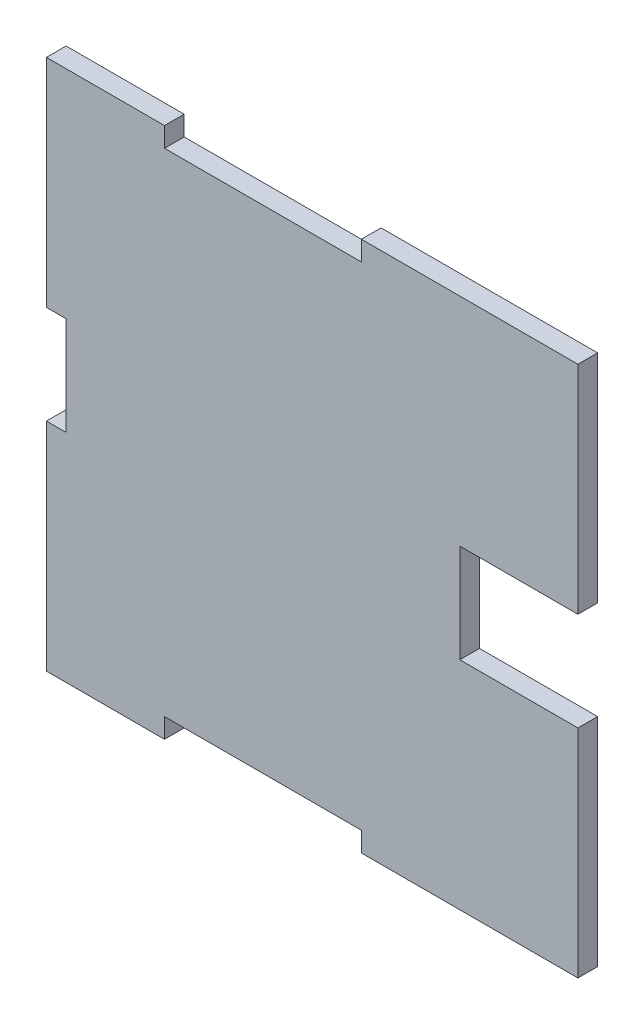
ISO-10303-21;
HEADER;
FILE_DESCRIPTION(('STEP AP214'),'2;1');
FILE_NAME('part.step','',(''),(''),'','','');
FILE_SCHEMA(('AUTOMOTIVE_DESIGN { 1 0 10303 214 1 1 1 1 }'));
ENDSEC;
DATA;
#1=APPLICATION_CONTEXT('core data for automotive mechanical design processes');
#2=APPLICATION_PROTOCOL_DEFINITION('international standard','automotive_design',2000,#1);
#3=PRODUCT_CONTEXT('',#1,'mechanical');
#4=PRODUCT('Part','Part','',(#3));
#5=PRODUCT_RELATED_PRODUCT_CATEGORY('part','',(#4));
#6=PRODUCT_DEFINITION_FORMATION('','',#4);
#7=PRODUCT_DEFINITION_CONTEXT('part definition',#1,'design');
#8=PRODUCT_DEFINITION('design','',#6,#7);
#9=PRODUCT_DEFINITION_SHAPE('','',#8);
#10=(LENGTH_UNIT() NAMED_UNIT(*) SI_UNIT(.MILLI.,.METRE.));
#11=(NAMED_UNIT(*) PLANE_ANGLE_UNIT() SI_UNIT($,.RADIAN.));
#12=(NAMED_UNIT(*) SI_UNIT($,.STERADIAN.) SOLID_ANGLE_UNIT());
#13=UNCERTAINTY_MEASURE_WITH_UNIT(LENGTH_MEASURE(1.E-05),#10,'distance_accuracy_value','');
#14=(GEOMETRIC_REPRESENTATION_CONTEXT(3) GLOBAL_UNCERTAINTY_ASSIGNED_CONTEXT((#13)) GLOBAL_UNIT_ASSIGNED_CONTEXT((#10,
#11,#12)) REPRESENTATION_CONTEXT('',''));
#15=CARTESIAN_POINT('',(0.,0.,0.));
#16=DIRECTION('',(0.,0.,1.));
#17=DIRECTION('',(1.,0.,0.));
#18=AXIS2_PLACEMENT_3D('',#15,#16,#17);
#19=CARTESIAN_POINT('',(54.,-54.,4.));
#20=DIRECTION('',(-1.,0.,0.));
#21=DIRECTION('',(0.,0.,1.));
#22=AXIS2_PLACEMENT_3D('',#19,#20,#21);
#23=PLANE('',#22);
#24=DIRECTION('',(0.,1.,0.));
#25=VECTOR('',#24,1.);
#26=CARTESIAN_POINT('',(54.,-54.,0.));
#27=LINE('',#26,#25);
#28=CARTESIAN_POINT('',(54.,-54.,0.));
#29=VERTEX_POINT('',#28);
#30=CARTESIAN_POINT('',(54.,-10.,0.));
#31=VERTEX_POINT('',#30);
#32=EDGE_CURVE('E342',#29,#31,#27,.T.);
#33=ORIENTED_EDGE('',*,*,#32,.T.);
#34=DIRECTION('',(0.,0.,1.));
#35=VECTOR('',#34,1.);
#36=CARTESIAN_POINT('',(54.,-10.,4.));
#37=LINE('',#36,#35);
#38=CARTESIAN_POINT('',(54.,-10.,4.));
#39=VERTEX_POINT('',#38);
#40=EDGE_CURVE('E309',#31,#39,#37,.T.);
#41=ORIENTED_EDGE('',*,*,#40,.T.);
#42=DIRECTION('',(0.,1.,0.));
#43=VECTOR('',#42,1.);
#44=CARTESIAN_POINT('',(54.,-54.,4.));
#45=LINE('',#44,#43);
#46=CARTESIAN_POINT('',(54.,-54.,4.));
#47=VERTEX_POINT('',#46);
#48=EDGE_CURVE('E322',#47,#39,#45,.T.);
#49=ORIENTED_EDGE('',*,*,#48,.F.);
#50=DIRECTION('',(0.,0.,-1.));
#51=VECTOR('',#50,1.);
#52=CARTESIAN_POINT('',(54.,-54.,4.));
#53=LINE('',#52,#51);
#54=EDGE_CURVE('E341',#47,#29,#53,.T.);
#55=ORIENTED_EDGE('',*,*,#54,.T.);
#56=EDGE_LOOP('',(#33,#41,#49,#55));
#57=FACE_BOUND('',#56,.T.);
#58=ADVANCED_FACE('F39',(#57),#23,.F.);
#59=CARTESIAN_POINT('',(-54.,54.,4.));
#60=DIRECTION('',(0.,-1.,0.));
#61=DIRECTION('',(0.,0.,-1.));
#62=AXIS2_PLACEMENT_3D('',#59,#60,#61);
#63=PLANE('',#62);
#64=DIRECTION('',(-1.,0.,0.));
#65=VECTOR('',#64,1.);
#66=CARTESIAN_POINT('',(-54.,54.,4.));
#67=LINE('',#66,#65);
#68=CARTESIAN_POINT('',(-30.,54.,4.));
#69=VERTEX_POINT('',#68);
#70=CARTESIAN_POINT('',(-54.,54.,4.));
#71=VERTEX_POINT('',#70);
#72=EDGE_CURVE('E326',#69,#71,#67,.T.);
#73=ORIENTED_EDGE('',*,*,#72,.F.);
#74=DIRECTION('',(0.,0.,-1.));
#75=VECTOR('',#74,1.);
#76=CARTESIAN_POINT('',(-30.,54.,4.));
#77=LINE('',#76,#75);
#78=CARTESIAN_POINT('',(-30.,54.,0.));
#79=VERTEX_POINT('',#78);
#80=EDGE_CURVE('E198',#69,#79,#77,.T.);
#81=ORIENTED_EDGE('',*,*,#80,.T.);
#82=DIRECTION('',(-1.,0.,0.));
#83=VECTOR('',#82,1.);
#84=CARTESIAN_POINT('',(-54.,54.,0.));
#85=LINE('',#84,#83);
#86=CARTESIAN_POINT('',(-54.,54.,0.));
#87=VERTEX_POINT('',#86);
#88=EDGE_CURVE('E346',#79,#87,#85,.T.);
#89=ORIENTED_EDGE('',*,*,#88,.T.);
#90=DIRECTION('',(0.,0.,-1.));
#91=VECTOR('',#90,1.);
#92=CARTESIAN_POINT('',(-54.,54.,4.));
#93=LINE('',#92,#91);
#94=EDGE_CURVE('E368',#71,#87,#93,.T.);
#95=ORIENTED_EDGE('',*,*,#94,.F.);
#96=EDGE_LOOP('',(#73,#81,#89,#95));
#97=FACE_BOUND('',#96,.T.);
#98=ADVANCED_FACE('F456',(#97),#63,.F.);
#99=CARTESIAN_POINT('',(-54.,-54.,4.));
#100=DIRECTION('',(1.,0.,0.));
#101=DIRECTION('',(0.,0.,-1.));
#102=AXIS2_PLACEMENT_3D('',#99,#100,#101);
#103=PLANE('',#102);
#104=DIRECTION('',(0.,-1.,0.));
#105=VECTOR('',#104,1.);
#106=CARTESIAN_POINT('',(-54.,-54.,4.));
#107=LINE('',#106,#105);
#108=CARTESIAN_POINT('',(-54.,-10.,4.));
#109=VERTEX_POINT('',#108);
#110=CARTESIAN_POINT('',(-54.,-54.,4.));
#111=VERTEX_POINT('',#110);
#112=EDGE_CURVE('E331',#109,#111,#107,.T.);
#113=ORIENTED_EDGE('',*,*,#112,.F.);
#114=DIRECTION('',(0.,0.,-1.));
#115=VECTOR('',#114,1.);
#116=CARTESIAN_POINT('',(-54.,-10.,4.));
#117=LINE('',#116,#115);
#118=CARTESIAN_POINT('',(-54.,-10.,0.));
#119=VERTEX_POINT('',#118);
#120=EDGE_CURVE('E315',#109,#119,#117,.T.);
#121=ORIENTED_EDGE('',*,*,#120,.T.);
#122=DIRECTION('',(0.,-1.,0.));
#123=VECTOR('',#122,1.);
#124=CARTESIAN_POINT('',(-54.,-54.,0.));
#125=LINE('',#124,#123);
#126=CARTESIAN_POINT('',(-54.,-54.,0.));
#127=VERTEX_POINT('',#126);
#128=EDGE_CURVE('E351',#119,#127,#125,.T.);
#129=ORIENTED_EDGE('',*,*,#128,.T.);
#130=DIRECTION('',(0.,0.,-1.));
#131=VECTOR('',#130,1.);
#132=CARTESIAN_POINT('',(-54.,-54.,4.));
#133=LINE('',#132,#131);
#134=EDGE_CURVE('E364',#111,#127,#133,.T.);
#135=ORIENTED_EDGE('',*,*,#134,.F.);
#136=EDGE_LOOP('',(#113,#121,#129,#135));
#137=FACE_BOUND('',#136,.T.);
#138=ADVANCED_FACE('F395',(#137),#103,.F.);
#139=CARTESIAN_POINT('',(-54.,-54.,4.));
#140=DIRECTION('',(0.,1.,0.));
#141=DIRECTION('',(0.,0.,1.));
#142=AXIS2_PLACEMENT_3D('',#139,#140,#141);
#143=PLANE('',#142);
#144=DIRECTION('',(1.,0.,0.));
#145=VECTOR('',#144,1.);
#146=CARTESIAN_POINT('',(-54.,-54.,0.));
#147=LINE('',#146,#145);
#148=CARTESIAN_POINT('',(-30.,-54.,0.));
#149=VERTEX_POINT('',#148);
#150=EDGE_CURVE('E357',#127,#149,#147,.T.);
#151=ORIENTED_EDGE('',*,*,#150,.T.);
#152=DIRECTION('',(0.,0.,-1.));
#153=VECTOR('',#152,1.);
#154=CARTESIAN_POINT('',(-30.,-54.,4.));
#155=LINE('',#154,#153);
#156=CARTESIAN_POINT('',(-30.,-54.,4.));
#157=VERTEX_POINT('',#156);
#158=EDGE_CURVE('E216',#157,#149,#155,.T.);
#159=ORIENTED_EDGE('',*,*,#158,.F.);
#160=DIRECTION('',(1.,0.,0.));
#161=VECTOR('',#160,1.);
#162=CARTESIAN_POINT('',(-54.,-54.,4.));
#163=LINE('',#162,#161);
#164=EDGE_CURVE('E337',#111,#157,#163,.T.);
#165=ORIENTED_EDGE('',*,*,#164,.F.);
#166=ORIENTED_EDGE('',*,*,#134,.T.);
#167=EDGE_LOOP('',(#151,#159,#165,#166));
#168=FACE_BOUND('',#167,.T.);
#169=ADVANCED_FACE('F444',(#168),#143,.F.);
#170=CARTESIAN_POINT('',(54.,10.,4.));
#171=VERTEX_POINT('',#170);
#172=CARTESIAN_POINT('',(54.,54.,4.));
#173=VERTEX_POINT('',#172);
#174=EDGE_CURVE('E327',#171,#173,#45,.T.);
#175=ORIENTED_EDGE('',*,*,#174,.F.);
#176=DIRECTION('',(0.,0.,-1.));
#177=VECTOR('',#176,1.);
#178=CARTESIAN_POINT('',(54.,10.,4.));
#179=LINE('',#178,#177);
#180=CARTESIAN_POINT('',(54.,10.,0.));
#181=VERTEX_POINT('',#180);
#182=EDGE_CURVE('E305',#171,#181,#179,.T.);
#183=ORIENTED_EDGE('',*,*,#182,.T.);
#184=CARTESIAN_POINT('',(54.,54.,0.));
#185=VERTEX_POINT('',#184);
#186=EDGE_CURVE('E321',#181,#185,#27,.T.);
#187=ORIENTED_EDGE('',*,*,#186,.T.);
#188=DIRECTION('',(0.,0.,-1.));
#189=VECTOR('',#188,1.);
#190=CARTESIAN_POINT('',(54.,54.,4.));
#191=LINE('',#190,#189);
#192=EDGE_CURVE('E372',#173,#185,#191,.T.);
#193=ORIENTED_EDGE('',*,*,#192,.F.);
#194=EDGE_LOOP('',(#175,#183,#187,#193));
#195=FACE_BOUND('',#194,.T.);
#196=ADVANCED_FACE('F41',(#195),#23,.F.);
#197=CARTESIAN_POINT('',(10.,54.,0.));
#198=VERTEX_POINT('',#197);
#199=EDGE_CURVE('E347',#185,#198,#85,.T.);
#200=ORIENTED_EDGE('',*,*,#199,.T.);
#201=DIRECTION('',(0.,0.,1.));
#202=VECTOR('',#201,1.);
#203=CARTESIAN_POINT('',(10.,54.,4.));
#204=LINE('',#203,#202);
#205=CARTESIAN_POINT('',(10.,54.,4.));
#206=VERTEX_POINT('',#205);
#207=EDGE_CURVE('E54',#198,#206,#204,.T.);
#208=ORIENTED_EDGE('',*,*,#207,.T.);
#209=EDGE_CURVE('E328',#173,#206,#67,.T.);
#210=ORIENTED_EDGE('',*,*,#209,.F.);
#211=ORIENTED_EDGE('',*,*,#192,.T.);
#212=EDGE_LOOP('',(#200,#208,#210,#211));
#213=FACE_BOUND('',#212,.T.);
#214=ADVANCED_FACE('F413',(#213),#63,.F.);
#215=CARTESIAN_POINT('',(-54.,10.,0.));
#216=VERTEX_POINT('',#215);
#217=EDGE_CURVE('E352',#87,#216,#125,.T.);
#218=ORIENTED_EDGE('',*,*,#217,.T.);
#219=DIRECTION('',(0.,0.,1.));
#220=VECTOR('',#219,1.);
#221=CARTESIAN_POINT('',(-54.,10.,4.));
#222=LINE('',#221,#220);
#223=CARTESIAN_POINT('',(-54.,10.,4.));
#224=VERTEX_POINT('',#223);
#225=EDGE_CURVE('E62',#216,#224,#222,.T.);
#226=ORIENTED_EDGE('',*,*,#225,.T.);
#227=EDGE_CURVE('E332',#71,#224,#107,.T.);
#228=ORIENTED_EDGE('',*,*,#227,.F.);
#229=ORIENTED_EDGE('',*,*,#94,.T.);
#230=EDGE_LOOP('',(#218,#226,#228,#229));
#231=FACE_BOUND('',#230,.T.);
#232=ADVANCED_FACE('F467',(#231),#103,.F.);
#233=CARTESIAN_POINT('',(10.,-54.,4.));
#234=VERTEX_POINT('',#233);
#235=EDGE_CURVE('E336',#234,#47,#163,.T.);
#236=ORIENTED_EDGE('',*,*,#235,.F.);
#237=DIRECTION('',(0.,0.,-1.));
#238=VECTOR('',#237,1.);
#239=CARTESIAN_POINT('',(10.,-54.,4.));
#240=LINE('',#239,#238);
#241=CARTESIAN_POINT('',(10.,-54.,0.));
#242=VERTEX_POINT('',#241);
#243=EDGE_CURVE('E249',#234,#242,#240,.T.);
#244=ORIENTED_EDGE('',*,*,#243,.T.);
#245=EDGE_CURVE('E356',#242,#29,#147,.T.);
#246=ORIENTED_EDGE('',*,*,#245,.T.);
#247=ORIENTED_EDGE('',*,*,#54,.F.);
#248=EDGE_LOOP('',(#236,#244,#246,#247));
#249=FACE_BOUND('',#248,.T.);
#250=ADVANCED_FACE('F431',(#249),#143,.F.);
#251=CARTESIAN_POINT('',(0.,0.,4.));
#252=DIRECTION('',(0.,0.,-1.));
#253=DIRECTION('',(-1.,0.,0.));
#254=AXIS2_PLACEMENT_3D('',#251,#252,#253);
#255=PLANE('',#254);
#256=DIRECTION('',(-1.,0.,0.));
#257=VECTOR('',#256,1.);
#258=CARTESIAN_POINT('',(10.,50.,4.));
#259=LINE('',#258,#257);
#260=CARTESIAN_POINT('',(10.,50.,4.));
#261=VERTEX_POINT('',#260);
#262=CARTESIAN_POINT('',(-30.,50.,4.));
#263=VERTEX_POINT('',#262);
#264=EDGE_CURVE('E177',#261,#263,#259,.T.);
#265=ORIENTED_EDGE('',*,*,#264,.T.);
#266=DIRECTION('',(0.,1.,0.));
#267=VECTOR('',#266,1.);
#268=CARTESIAN_POINT('',(-30.,54.,4.));
#269=LINE('',#268,#267);
#270=EDGE_CURVE('E181',#263,#69,#269,.T.);
#271=ORIENTED_EDGE('',*,*,#270,.T.);
#272=ORIENTED_EDGE('',*,*,#72,.T.);
#273=ORIENTED_EDGE('',*,*,#227,.T.);
#274=DIRECTION('',(1.,0.,0.));
#275=VECTOR('',#274,1.);
#276=CARTESIAN_POINT('',(-50.,10.,4.));
#277=LINE('',#276,#275);
#278=CARTESIAN_POINT('',(-50.,10.,4.));
#279=VERTEX_POINT('',#278);
#280=EDGE_CURVE('E250',#224,#279,#277,.T.);
#281=ORIENTED_EDGE('',*,*,#280,.T.);
#282=DIRECTION('',(0.,-1.,0.));
#283=VECTOR('',#282,1.);
#284=CARTESIAN_POINT('',(-50.,-10.,4.));
#285=LINE('',#284,#283);
#286=CARTESIAN_POINT('',(-50.,-10.,4.));
#287=VERTEX_POINT('',#286);
#288=EDGE_CURVE('E254',#279,#287,#285,.T.);
#289=ORIENTED_EDGE('',*,*,#288,.T.);
#290=DIRECTION('',(-1.,0.,0.));
#291=VECTOR('',#290,1.);
#292=CARTESIAN_POINT('',(-50.,-10.,4.));
#293=LINE('',#292,#291);
#294=EDGE_CURVE('E259',#287,#109,#293,.T.);
#295=ORIENTED_EDGE('',*,*,#294,.T.);
#296=ORIENTED_EDGE('',*,*,#112,.T.);
#297=ORIENTED_EDGE('',*,*,#164,.T.);
#298=DIRECTION('',(0.,1.,0.));
#299=VECTOR('',#298,1.);
#300=CARTESIAN_POINT('',(-30.,-50.,4.));
#301=LINE('',#300,#299);
#302=CARTESIAN_POINT('',(-30.,-50.,4.));
#303=VERTEX_POINT('',#302);
#304=EDGE_CURVE('E212',#157,#303,#301,.T.);
#305=ORIENTED_EDGE('',*,*,#304,.T.);
#306=DIRECTION('',(1.,0.,0.));
#307=VECTOR('',#306,1.);
#308=CARTESIAN_POINT('',(10.,-50.,4.));
#309=LINE('',#308,#307);
#310=CARTESIAN_POINT('',(10.,-50.,4.));
#311=VERTEX_POINT('',#310);
#312=EDGE_CURVE('E286',#303,#311,#309,.T.);
#313=ORIENTED_EDGE('',*,*,#312,.T.);
#314=DIRECTION('',(0.,-1.,0.));
#315=VECTOR('',#314,1.);
#316=CARTESIAN_POINT('',(10.,-58.,4.));
#317=LINE('',#316,#315);
#318=EDGE_CURVE('E290',#311,#234,#317,.T.);
#319=ORIENTED_EDGE('',*,*,#318,.T.);
#320=ORIENTED_EDGE('',*,*,#235,.T.);
#321=ORIENTED_EDGE('',*,*,#48,.T.);
#322=DIRECTION('',(-1.,0.,0.));
#323=VECTOR('',#322,1.);
#324=CARTESIAN_POINT('',(58.,-10.,4.));
#325=LINE('',#324,#323);
#326=CARTESIAN_POINT('',(30.,-10.,4.));
#327=VERTEX_POINT('',#326);
#328=EDGE_CURVE('E268',#39,#327,#325,.T.);
#329=ORIENTED_EDGE('',*,*,#328,.T.);
#330=DIRECTION('',(0.,1.,0.));
#331=VECTOR('',#330,1.);
#332=CARTESIAN_POINT('',(30.,10.,4.));
#333=LINE('',#332,#331);
#334=CARTESIAN_POINT('',(30.,10.,4.));
#335=VERTEX_POINT('',#334);
#336=EDGE_CURVE('E227',#327,#335,#333,.T.);
#337=ORIENTED_EDGE('',*,*,#336,.T.);
#338=DIRECTION('',(1.,0.,0.));
#339=VECTOR('',#338,1.);
#340=CARTESIAN_POINT('',(58.,10.,4.));
#341=LINE('',#340,#339);
#342=EDGE_CURVE('E276',#335,#171,#341,.T.);
#343=ORIENTED_EDGE('',*,*,#342,.T.);
#344=ORIENTED_EDGE('',*,*,#174,.T.);
#345=ORIENTED_EDGE('',*,*,#209,.T.);
#346=DIRECTION('',(0.,-1.,0.));
#347=VECTOR('',#346,1.);
#348=CARTESIAN_POINT('',(10.,58.,4.));
#349=LINE('',#348,#347);
#350=EDGE_CURVE('E184',#206,#261,#349,.T.);
#351=ORIENTED_EDGE('',*,*,#350,.T.);
#352=EDGE_LOOP('',(#265,#271,#272,#273,#281,#289,#295,#296,#297,#305,#313,#319,#320,#321,#329,
#337,#343,#344,#345,#351));
#353=FACE_BOUND('',#352,.T.);
#354=ADVANCED_FACE('F179',(#353),#255,.F.);
#355=CARTESIAN_POINT('',(0.,0.,0.));
#356=DIRECTION('',(0.,0.,-1.));
#357=DIRECTION('',(-1.,0.,0.));
#358=AXIS2_PLACEMENT_3D('',#355,#356,#357);
#359=PLANE('',#358);
#360=DIRECTION('',(0.,1.,0.));
#361=VECTOR('',#360,1.);
#362=CARTESIAN_POINT('',(-30.,54.,0.));
#363=LINE('',#362,#361);
#364=CARTESIAN_POINT('',(-30.,50.,0.));
#365=VERTEX_POINT('',#364);
#366=EDGE_CURVE('E203',#365,#79,#363,.T.);
#367=ORIENTED_EDGE('',*,*,#366,.F.);
#368=DIRECTION('',(-1.,0.,0.));
#369=VECTOR('',#368,1.);
#370=CARTESIAN_POINT('',(10.,50.,0.));
#371=LINE('',#370,#369);
#372=CARTESIAN_POINT('',(10.,50.,0.));
#373=VERTEX_POINT('',#372);
#374=EDGE_CURVE('E194',#373,#365,#371,.T.);
#375=ORIENTED_EDGE('',*,*,#374,.F.);
#376=DIRECTION('',(0.,-1.,0.));
#377=VECTOR('',#376,1.);
#378=CARTESIAN_POINT('',(10.,0.,0.));
#379=LINE('',#378,#377);
#380=EDGE_CURVE('E11',#198,#373,#379,.T.);
#381=ORIENTED_EDGE('',*,*,#380,.F.);
#382=ORIENTED_EDGE('',*,*,#199,.F.);
#383=ORIENTED_EDGE('',*,*,#186,.F.);
#384=DIRECTION('',(1.,0.,0.));
#385=VECTOR('',#384,1.);
#386=CARTESIAN_POINT('',(58.,10.,0.));
#387=LINE('',#386,#385);
#388=CARTESIAN_POINT('',(30.,10.,0.));
#389=VERTEX_POINT('',#388);
#390=EDGE_CURVE('E280',#389,#181,#387,.T.);
#391=ORIENTED_EDGE('',*,*,#390,.F.);
#392=DIRECTION('',(0.,1.,0.));
#393=VECTOR('',#392,1.);
#394=CARTESIAN_POINT('',(30.,10.,0.));
#395=LINE('',#394,#393);
#396=CARTESIAN_POINT('',(30.,-10.,0.));
#397=VERTEX_POINT('',#396);
#398=EDGE_CURVE('E232',#397,#389,#395,.T.);
#399=ORIENTED_EDGE('',*,*,#398,.F.);
#400=DIRECTION('',(-1.,0.,0.));
#401=VECTOR('',#400,1.);
#402=CARTESIAN_POINT('',(0.,-10.,0.));
#403=LINE('',#402,#401);
#404=EDGE_CURVE('E376',#31,#397,#403,.T.);
#405=ORIENTED_EDGE('',*,*,#404,.F.);
#406=ORIENTED_EDGE('',*,*,#32,.F.);
#407=ORIENTED_EDGE('',*,*,#245,.F.);
#408=DIRECTION('',(0.,-1.,0.));
#409=VECTOR('',#408,1.);
#410=CARTESIAN_POINT('',(10.,-58.,0.));
#411=LINE('',#410,#409);
#412=CARTESIAN_POINT('',(10.,-50.,0.));
#413=VERTEX_POINT('',#412);
#414=EDGE_CURVE('E291',#413,#242,#411,.T.);
#415=ORIENTED_EDGE('',*,*,#414,.F.);
#416=DIRECTION('',(1.,0.,0.));
#417=VECTOR('',#416,1.);
#418=CARTESIAN_POINT('',(10.,-50.,0.));
#419=LINE('',#418,#417);
#420=CARTESIAN_POINT('',(-30.,-50.,0.));
#421=VERTEX_POINT('',#420);
#422=EDGE_CURVE('E210',#421,#413,#419,.T.);
#423=ORIENTED_EDGE('',*,*,#422,.F.);
#424=DIRECTION('',(0.,1.,0.));
#425=VECTOR('',#424,1.);
#426=CARTESIAN_POINT('',(-30.,-50.,0.));
#427=LINE('',#426,#425);
#428=EDGE_CURVE('E217',#149,#421,#427,.T.);
#429=ORIENTED_EDGE('',*,*,#428,.F.);
#430=ORIENTED_EDGE('',*,*,#150,.F.);
#431=ORIENTED_EDGE('',*,*,#128,.F.);
#432=DIRECTION('',(-1.,0.,0.));
#433=VECTOR('',#432,1.);
#434=CARTESIAN_POINT('',(-50.,-10.,0.));
#435=LINE('',#434,#433);
#436=CARTESIAN_POINT('',(-50.,-10.,0.));
#437=VERTEX_POINT('',#436);
#438=EDGE_CURVE('E255',#437,#119,#435,.T.);
#439=ORIENTED_EDGE('',*,*,#438,.F.);
#440=DIRECTION('',(0.,-1.,0.));
#441=VECTOR('',#440,1.);
#442=CARTESIAN_POINT('',(-50.,-10.,0.));
#443=LINE('',#442,#441);
#444=CARTESIAN_POINT('',(-50.,10.,0.));
#445=VERTEX_POINT('',#444);
#446=EDGE_CURVE('E264',#445,#437,#443,.T.);
#447=ORIENTED_EDGE('',*,*,#446,.F.);
#448=DIRECTION('',(1.,0.,0.));
#449=VECTOR('',#448,1.);
#450=CARTESIAN_POINT('',(0.,10.,0.));
#451=LINE('',#450,#449);
#452=EDGE_CURVE('E48',#216,#445,#451,.T.);
#453=ORIENTED_EDGE('',*,*,#452,.F.);
#454=ORIENTED_EDGE('',*,*,#217,.F.);
#455=ORIENTED_EDGE('',*,*,#88,.F.);
#456=EDGE_LOOP('',(#367,#375,#381,#382,#383,#391,#399,#405,#406,#407,#415,#423,#429,#430,#431,
#439,#447,#453,#454,#455));
#457=FACE_BOUND('',#456,.T.);
#458=ADVANCED_FACE('F387',(#457),#359,.T.);
#459=CARTESIAN_POINT('',(10.,-58.,4.));
#460=DIRECTION('',(1.,0.,0.));
#461=DIRECTION('',(0.,0.,-1.));
#462=AXIS2_PLACEMENT_3D('',#459,#460,#461);
#463=PLANE('',#462);
#464=ORIENTED_EDGE('',*,*,#318,.F.);
#465=DIRECTION('',(0.,0.,-1.));
#466=VECTOR('',#465,1.);
#467=CARTESIAN_POINT('',(10.,-50.,4.));
#468=LINE('',#467,#466);
#469=EDGE_CURVE('E285',#311,#413,#468,.T.);
#470=ORIENTED_EDGE('',*,*,#469,.T.);
#471=ORIENTED_EDGE('',*,*,#414,.T.);
#472=ORIENTED_EDGE('',*,*,#243,.F.);
#473=EDGE_LOOP('',(#464,#470,#471,#472));
#474=FACE_BOUND('',#473,.T.);
#475=ADVANCED_FACE('F436',(#474),#463,.F.);
#476=CARTESIAN_POINT('',(10.,-50.,4.));
#477=DIRECTION('',(0.,1.,0.));
#478=DIRECTION('',(0.,0.,1.));
#479=AXIS2_PLACEMENT_3D('',#476,#477,#478);
#480=PLANE('',#479);
#481=ORIENTED_EDGE('',*,*,#422,.T.);
#482=ORIENTED_EDGE('',*,*,#469,.F.);
#483=ORIENTED_EDGE('',*,*,#312,.F.);
#484=DIRECTION('',(0.,0.,-1.));
#485=VECTOR('',#484,1.);
#486=CARTESIAN_POINT('',(-30.,-50.,4.));
#487=LINE('',#486,#485);
#488=EDGE_CURVE('E206',#303,#421,#487,.T.);
#489=ORIENTED_EDGE('',*,*,#488,.T.);
#490=EDGE_LOOP('',(#481,#482,#483,#489));
#491=FACE_BOUND('',#490,.T.);
#492=ADVANCED_FACE('F438',(#491),#480,.F.);
#493=CARTESIAN_POINT('',(58.,-10.,4.));
#494=DIRECTION('',(0.,-1.,0.));
#495=DIRECTION('',(0.,0.,-1.));
#496=AXIS2_PLACEMENT_3D('',#493,#494,#495);
#497=PLANE('',#496);
#498=ORIENTED_EDGE('',*,*,#404,.T.);
#499=DIRECTION('',(0.,0.,-1.));
#500=VECTOR('',#499,1.);
#501=CARTESIAN_POINT('',(30.,-10.,4.));
#502=LINE('',#501,#500);
#503=EDGE_CURVE('E231',#327,#397,#502,.T.);
#504=ORIENTED_EDGE('',*,*,#503,.F.);
#505=ORIENTED_EDGE('',*,*,#328,.F.);
#506=ORIENTED_EDGE('',*,*,#40,.F.);
#507=EDGE_LOOP('',(#498,#504,#505,#506));
#508=FACE_BOUND('',#507,.T.);
#509=ADVANCED_FACE('F445',(#508),#497,.F.);
#510=CARTESIAN_POINT('',(58.,10.,4.));
#511=DIRECTION('',(0.,1.,0.));
#512=DIRECTION('',(-1.,0.,0.));
#513=AXIS2_PLACEMENT_3D('',#510,#511,#512);
#514=PLANE('',#513);
#515=ORIENTED_EDGE('',*,*,#342,.F.);
#516=DIRECTION('',(0.,0.,-1.));
#517=VECTOR('',#516,1.);
#518=CARTESIAN_POINT('',(30.,10.,4.));
#519=LINE('',#518,#517);
#520=EDGE_CURVE('E221',#335,#389,#519,.T.);
#521=ORIENTED_EDGE('',*,*,#520,.T.);
#522=ORIENTED_EDGE('',*,*,#390,.T.);
#523=ORIENTED_EDGE('',*,*,#182,.F.);
#524=EDGE_LOOP('',(#515,#521,#522,#523));
#525=FACE_BOUND('',#524,.T.);
#526=ADVANCED_FACE('F417',(#525),#514,.F.);
#527=CARTESIAN_POINT('',(-50.,-10.,4.));
#528=DIRECTION('',(0.,-1.,0.));
#529=DIRECTION('',(0.,0.,-1.));
#530=AXIS2_PLACEMENT_3D('',#527,#528,#529);
#531=PLANE('',#530);
#532=ORIENTED_EDGE('',*,*,#294,.F.);
#533=DIRECTION('',(0.,0.,-1.));
#534=VECTOR('',#533,1.);
#535=CARTESIAN_POINT('',(-50.,-10.,4.));
#536=LINE('',#535,#534);
#537=EDGE_CURVE('E246',#287,#437,#536,.T.);
#538=ORIENTED_EDGE('',*,*,#537,.T.);
#539=ORIENTED_EDGE('',*,*,#438,.T.);
#540=ORIENTED_EDGE('',*,*,#120,.F.);
#541=EDGE_LOOP('',(#532,#538,#539,#540));
#542=FACE_BOUND('',#541,.T.);
#543=ADVANCED_FACE('F392',(#542),#531,.F.);
#544=CARTESIAN_POINT('',(-50.,10.,4.));
#545=DIRECTION('',(0.,1.,0.));
#546=DIRECTION('',(0.,0.,1.));
#547=AXIS2_PLACEMENT_3D('',#544,#545,#546);
#548=PLANE('',#547);
#549=ORIENTED_EDGE('',*,*,#452,.T.);
#550=DIRECTION('',(0.,0.,-1.));
#551=VECTOR('',#550,1.);
#552=CARTESIAN_POINT('',(-50.,10.,4.));
#553=LINE('',#552,#551);
#554=EDGE_CURVE('E263',#279,#445,#553,.T.);
#555=ORIENTED_EDGE('',*,*,#554,.F.);
#556=ORIENTED_EDGE('',*,*,#280,.F.);
#557=ORIENTED_EDGE('',*,*,#225,.F.);
#558=EDGE_LOOP('',(#549,#555,#556,#557));
#559=FACE_BOUND('',#558,.T.);
#560=ADVANCED_FACE('F379',(#559),#548,.F.);
#561=CARTESIAN_POINT('',(-50.,-10.,4.));
#562=DIRECTION('',(1.,0.,0.));
#563=DIRECTION('',(0.,0.,-1.));
#564=AXIS2_PLACEMENT_3D('',#561,#562,#563);
#565=PLANE('',#564);
#566=ORIENTED_EDGE('',*,*,#446,.T.);
#567=ORIENTED_EDGE('',*,*,#537,.F.);
#568=ORIENTED_EDGE('',*,*,#288,.F.);
#569=ORIENTED_EDGE('',*,*,#554,.T.);
#570=EDGE_LOOP('',(#566,#567,#568,#569));
#571=FACE_BOUND('',#570,.T.);
#572=ADVANCED_FACE('F385',(#571),#565,.F.);
#573=CARTESIAN_POINT('',(10.,58.,4.));
#574=DIRECTION('',(1.,0.,0.));
#575=DIRECTION('',(0.,0.,-1.));
#576=AXIS2_PLACEMENT_3D('',#573,#574,#575);
#577=PLANE('',#576);
#578=ORIENTED_EDGE('',*,*,#380,.T.);
#579=DIRECTION('',(0.,0.,-1.));
#580=VECTOR('',#579,1.);
#581=CARTESIAN_POINT('',(10.,50.,4.));
#582=LINE('',#581,#580);
#583=EDGE_CURVE('E188',#261,#373,#582,.T.);
#584=ORIENTED_EDGE('',*,*,#583,.F.);
#585=ORIENTED_EDGE('',*,*,#350,.F.);
#586=ORIENTED_EDGE('',*,*,#207,.F.);
#587=EDGE_LOOP('',(#578,#584,#585,#586));
#588=FACE_BOUND('',#587,.T.);
#589=ADVANCED_FACE('F561',(#588),#577,.F.);
#590=CARTESIAN_POINT('',(10.,50.,4.));
#591=DIRECTION('',(0.,-1.,0.));
#592=DIRECTION('',(0.,0.,-1.));
#593=AXIS2_PLACEMENT_3D('',#590,#591,#592);
#594=PLANE('',#593);
#595=ORIENTED_EDGE('',*,*,#374,.T.);
#596=DIRECTION('',(0.,0.,-1.));
#597=VECTOR('',#596,1.);
#598=CARTESIAN_POINT('',(-30.,50.,4.));
#599=LINE('',#598,#597);
#600=EDGE_CURVE('E191',#263,#365,#599,.T.);
#601=ORIENTED_EDGE('',*,*,#600,.F.);
#602=ORIENTED_EDGE('',*,*,#264,.F.);
#603=ORIENTED_EDGE('',*,*,#583,.T.);
#604=EDGE_LOOP('',(#595,#601,#602,#603));
#605=FACE_BOUND('',#604,.T.);
#606=ADVANCED_FACE('F192',(#605),#594,.F.);
#607=CARTESIAN_POINT('',(-30.,54.,4.));
#608=DIRECTION('',(-1.,0.,0.));
#609=DIRECTION('',(0.,0.,1.));
#610=AXIS2_PLACEMENT_3D('',#607,#608,#609);
#611=PLANE('',#610);
#612=ORIENTED_EDGE('',*,*,#366,.T.);
#613=ORIENTED_EDGE('',*,*,#80,.F.);
#614=ORIENTED_EDGE('',*,*,#270,.F.);
#615=ORIENTED_EDGE('',*,*,#600,.T.);
#616=EDGE_LOOP('',(#612,#613,#614,#615));
#617=FACE_BOUND('',#616,.T.);
#618=ADVANCED_FACE('F200',(#617),#611,.F.);
#619=CARTESIAN_POINT('',(30.,10.,4.));
#620=DIRECTION('',(-1.,0.,0.));
#621=DIRECTION('',(0.,-1.,0.));
#622=AXIS2_PLACEMENT_3D('',#619,#620,#621);
#623=PLANE('',#622);
#624=ORIENTED_EDGE('',*,*,#398,.T.);
#625=ORIENTED_EDGE('',*,*,#520,.F.);
#626=ORIENTED_EDGE('',*,*,#336,.F.);
#627=ORIENTED_EDGE('',*,*,#503,.T.);
#628=EDGE_LOOP('',(#624,#625,#626,#627));
#629=FACE_BOUND('',#628,.T.);
#630=ADVANCED_FACE('F419',(#629),#623,.F.);
#631=CARTESIAN_POINT('',(-30.,-50.,4.));
#632=DIRECTION('',(-1.,0.,0.));
#633=DIRECTION('',(0.,0.,1.));
#634=AXIS2_PLACEMENT_3D('',#631,#632,#633);
#635=PLANE('',#634);
#636=ORIENTED_EDGE('',*,*,#428,.T.);
#637=ORIENTED_EDGE('',*,*,#488,.F.);
#638=ORIENTED_EDGE('',*,*,#304,.F.);
#639=ORIENTED_EDGE('',*,*,#158,.T.);
#640=EDGE_LOOP('',(#636,#637,#638,#639));
#641=FACE_BOUND('',#640,.T.);
#642=ADVANCED_FACE('F441',(#641),#635,.F.);
#643=CLOSED_SHELL('',(#58,#98,#138,#169,#196,#214,#232,#250,#354,#458,#475,#492,#509,#526,#543,
#560,#572,#589,#606,#618,#630,#642));
#644=MANIFOLD_SOLID_BREP('B2',#643);
#645=ADVANCED_BREP_SHAPE_REPRESENTATION('',(#18,#644),#14);
#646=SHAPE_DEFINITION_REPRESENTATION(#9,#645);
ENDSEC;
END-ISO-10303-21;
